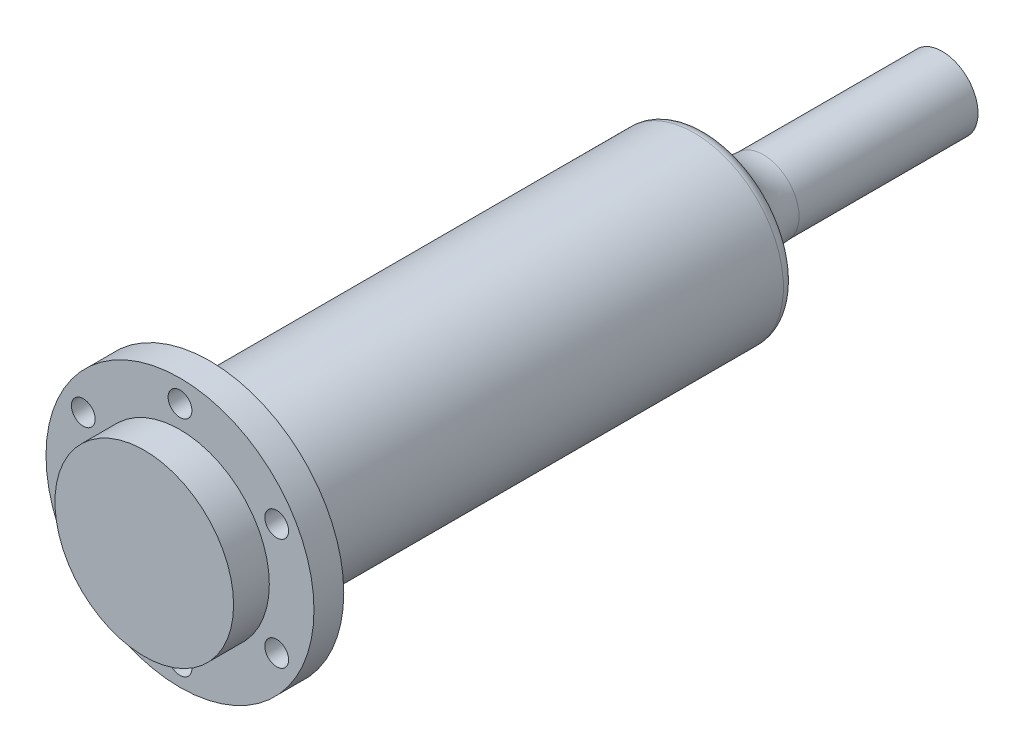
ISO-10303-21;
HEADER;
FILE_DESCRIPTION(('STEP AP214'),'2;1');
FILE_NAME('part.step','',(''),(''),'','','');
FILE_SCHEMA(('AUTOMOTIVE_DESIGN { 1 0 10303 214 1 1 1 1 }'));
ENDSEC;
DATA;
#1=APPLICATION_CONTEXT('core data for automotive mechanical design processes');
#2=APPLICATION_PROTOCOL_DEFINITION('international standard','automotive_design',2000,#1);
#3=PRODUCT_CONTEXT('',#1,'mechanical');
#4=PRODUCT('Part','Part','',(#3));
#5=PRODUCT_RELATED_PRODUCT_CATEGORY('part','',(#4));
#6=PRODUCT_DEFINITION_FORMATION('','',#4);
#7=PRODUCT_DEFINITION_CONTEXT('part definition',#1,'design');
#8=PRODUCT_DEFINITION('design','',#6,#7);
#9=PRODUCT_DEFINITION_SHAPE('','',#8);
#10=(LENGTH_UNIT() NAMED_UNIT(*) SI_UNIT(.MILLI.,.METRE.));
#11=(NAMED_UNIT(*) PLANE_ANGLE_UNIT() SI_UNIT($,.RADIAN.));
#12=(NAMED_UNIT(*) SI_UNIT($,.STERADIAN.) SOLID_ANGLE_UNIT());
#13=UNCERTAINTY_MEASURE_WITH_UNIT(LENGTH_MEASURE(1.E-05),#10,'distance_accuracy_value','');
#14=(GEOMETRIC_REPRESENTATION_CONTEXT(3) GLOBAL_UNCERTAINTY_ASSIGNED_CONTEXT((#13)) GLOBAL_UNIT_ASSIGNED_CONTEXT((#10,
#11,#12)) REPRESENTATION_CONTEXT('',''));
#15=CARTESIAN_POINT('',(0.,0.,0.));
#16=DIRECTION('',(0.,0.,1.));
#17=DIRECTION('',(1.,0.,0.));
#18=AXIS2_PLACEMENT_3D('',#15,#16,#17);
#19=CARTESIAN_POINT('',(0.,0.,77.));
#20=DIRECTION('',(0.,0.,-1.));
#21=DIRECTION('',(-1.,0.,0.));
#22=AXIS2_PLACEMENT_3D('',#19,#20,#21);
#23=CYLINDRICAL_SURFACE('',#22,15.);
#24=CARTESIAN_POINT('',(0.,0.,88.));
#25=DIRECTION('',(0.,0.,1.));
#26=DIRECTION('',(1.,0.,0.));
#27=AXIS2_PLACEMENT_3D('',#24,#25,#26);
#28=CIRCLE('',#27,15.);
#29=CARTESIAN_POINT('',(15.,0.,88.));
#30=VERTEX_POINT('',#29);
#31=EDGE_CURVE('E54',#30,#30,#28,.T.);
#32=ORIENTED_EDGE('',*,*,#31,.T.);
#33=EDGE_LOOP('',(#32));
#34=FACE_BOUND('',#33,.T.);
#35=CARTESIAN_POINT('',(0.,0.,94.));
#36=DIRECTION('',(0.,0.,1.));
#37=DIRECTION('',(1.,0.,0.));
#38=AXIS2_PLACEMENT_3D('',#35,#36,#37);
#39=CIRCLE('',#38,15.);
#40=CARTESIAN_POINT('',(15.,0.,94.));
#41=VERTEX_POINT('',#40);
#42=EDGE_CURVE('E53',#41,#41,#39,.T.);
#43=ORIENTED_EDGE('',*,*,#42,.F.);
#44=EDGE_LOOP('',(#43));
#45=FACE_BOUND('',#44,.T.);
#46=ADVANCED_FACE('F33',(#34,#45),#23,.T.);
#47=CARTESIAN_POINT('',(0.,0.,94.));
#48=DIRECTION('',(0.,0.,1.));
#49=DIRECTION('',(1.,0.,0.));
#50=AXIS2_PLACEMENT_3D('',#47,#48,#49);
#51=PLANE('',#50);
#52=ORIENTED_EDGE('',*,*,#42,.T.);
#53=EDGE_LOOP('',(#52));
#54=FACE_BOUND('',#53,.T.);
#55=ADVANCED_FACE('F120',(#54),#51,.T.);
#56=CARTESIAN_POINT('',(0.,0.,83.));
#57=DIRECTION('',(0.,0.,1.));
#58=DIRECTION('',(1.,0.,0.));
#59=AXIS2_PLACEMENT_3D('',#56,#57,#58);
#60=CYLINDRICAL_SURFACE('',#59,22.5);
#61=CARTESIAN_POINT('',(0.,0.,83.));
#62=DIRECTION('',(0.,0.,1.));
#63=DIRECTION('',(1.,0.,0.));
#64=AXIS2_PLACEMENT_3D('',#61,#62,#63);
#65=CIRCLE('',#64,22.5);
#66=CARTESIAN_POINT('',(22.5,0.,83.));
#67=VERTEX_POINT('',#66);
#68=EDGE_CURVE('E57',#67,#67,#65,.T.);
#69=ORIENTED_EDGE('',*,*,#68,.T.);
#70=EDGE_LOOP('',(#69));
#71=FACE_BOUND('',#70,.T.);
#72=CARTESIAN_POINT('',(0.,0.,88.));
#73=DIRECTION('',(0.,0.,1.));
#74=DIRECTION('',(1.,0.,0.));
#75=AXIS2_PLACEMENT_3D('',#72,#73,#74);
#76=CIRCLE('',#75,22.5);
#77=CARTESIAN_POINT('',(22.5,0.,88.));
#78=VERTEX_POINT('',#77);
#79=EDGE_CURVE('E60',#78,#78,#76,.T.);
#80=ORIENTED_EDGE('',*,*,#79,.F.);
#81=EDGE_LOOP('',(#80));
#82=FACE_BOUND('',#81,.T.);
#83=ADVANCED_FACE('F126',(#71,#82),#60,.T.);
#84=CARTESIAN_POINT('',(0.,0.,83.));
#85=DIRECTION('',(0.,0.,1.));
#86=DIRECTION('',(1.,0.,0.));
#87=AXIS2_PLACEMENT_3D('',#84,#85,#86);
#88=PLANE('',#87);
#89=CARTESIAN_POINT('',(0.,0.,83.));
#90=DIRECTION('',(0.,0.,1.));
#91=DIRECTION('',(1.,0.,0.));
#92=AXIS2_PLACEMENT_3D('',#89,#90,#91);
#93=CIRCLE('',#92,15.);
#94=CARTESIAN_POINT('',(15.,0.,83.));
#95=VERTEX_POINT('',#94);
#96=EDGE_CURVE('E48',#95,#95,#93,.T.);
#97=ORIENTED_EDGE('',*,*,#96,.T.);
#98=EDGE_LOOP('',(#97));
#99=FACE_BOUND('',#98,.T.);
#100=CARTESIAN_POINT('',(-16.2379763209579,9.37499999999936,83.));
#101=DIRECTION('',(0.,0.,1.));
#102=DIRECTION('',(1.,0.,0.));
#103=AXIS2_PLACEMENT_3D('',#100,#101,#102);
#104=CIRCLE('',#103,2.);
#105=CARTESIAN_POINT('',(-14.2379763209579,9.37499999999936,83.));
#106=VERTEX_POINT('',#105);
#107=EDGE_CURVE('E93',#106,#106,#104,.T.);
#108=ORIENTED_EDGE('',*,*,#107,.T.);
#109=EDGE_LOOP('',(#108));
#110=FACE_BOUND('',#109,.T.);
#111=CARTESIAN_POINT('',(-16.2379763209571,-9.37500000000063,83.));
#112=DIRECTION('',(0.,0.,1.));
#113=DIRECTION('',(1.,0.,0.));
#114=AXIS2_PLACEMENT_3D('',#111,#112,#113);
#115=CIRCLE('',#114,2.);
#116=CARTESIAN_POINT('',(-14.2379763209571,-9.37500000000063,83.));
#117=VERTEX_POINT('',#116);
#118=EDGE_CURVE('E87',#117,#117,#115,.T.);
#119=ORIENTED_EDGE('',*,*,#118,.T.);
#120=EDGE_LOOP('',(#119));
#121=FACE_BOUND('',#120,.T.);
#122=CARTESIAN_POINT('',(1.4434757954648E-12,-18.75,83.));
#123=DIRECTION('',(0.,0.,1.));
#124=DIRECTION('',(1.,0.,0.));
#125=AXIS2_PLACEMENT_3D('',#122,#123,#124);
#126=CIRCLE('',#125,2.);
#127=CARTESIAN_POINT('',(2.00000000000144,-18.75,83.));
#128=VERTEX_POINT('',#127);
#129=EDGE_CURVE('E81',#128,#128,#126,.T.);
#130=ORIENTED_EDGE('',*,*,#129,.T.);
#131=EDGE_LOOP('',(#130));
#132=FACE_BOUND('',#131,.T.);
#133=CARTESIAN_POINT('',(16.2379763209593,-9.37499999999937,83.));
#134=DIRECTION('',(0.,0.,1.));
#135=DIRECTION('',(1.,0.,0.));
#136=AXIS2_PLACEMENT_3D('',#133,#134,#135);
#137=CIRCLE('',#136,2.);
#138=CARTESIAN_POINT('',(18.2379763209593,-9.37499999999937,83.));
#139=VERTEX_POINT('',#138);
#140=EDGE_CURVE('E75',#139,#139,#137,.T.);
#141=ORIENTED_EDGE('',*,*,#140,.T.);
#142=EDGE_LOOP('',(#141));
#143=FACE_BOUND('',#142,.T.);
#144=CARTESIAN_POINT('',(16.2379763209586,9.37500000000063,83.));
#145=DIRECTION('',(0.,0.,1.));
#146=DIRECTION('',(1.,0.,0.));
#147=AXIS2_PLACEMENT_3D('',#144,#145,#146);
#148=CIRCLE('',#147,2.);
#149=CARTESIAN_POINT('',(18.2379763209586,9.37500000000063,83.));
#150=VERTEX_POINT('',#149);
#151=EDGE_CURVE('E69',#150,#150,#148,.T.);
#152=ORIENTED_EDGE('',*,*,#151,.T.);
#153=EDGE_LOOP('',(#152));
#154=FACE_BOUND('',#153,.T.);
#155=CARTESIAN_POINT('',(0.,18.75,83.));
#156=DIRECTION('',(0.,0.,1.));
#157=DIRECTION('',(1.,0.,0.));
#158=AXIS2_PLACEMENT_3D('',#155,#156,#157);
#159=CIRCLE('',#158,2.);
#160=CARTESIAN_POINT('',(2.,18.75,83.));
#161=VERTEX_POINT('',#160);
#162=EDGE_CURVE('E63',#161,#161,#159,.T.);
#163=ORIENTED_EDGE('',*,*,#162,.T.);
#164=EDGE_LOOP('',(#163));
#165=FACE_BOUND('',#164,.T.);
#166=ORIENTED_EDGE('',*,*,#68,.F.);
#167=EDGE_LOOP('',(#166));
#168=FACE_BOUND('',#167,.T.);
#169=ADVANCED_FACE('F140',(#99,#110,#121,#132,#143,#154,#165,#168),#88,.F.);
#170=CARTESIAN_POINT('',(0.,0.,88.));
#171=DIRECTION('',(0.,0.,1.));
#172=DIRECTION('',(1.,0.,0.));
#173=AXIS2_PLACEMENT_3D('',#170,#171,#172);
#174=PLANE('',#173);
#175=ORIENTED_EDGE('',*,*,#31,.F.);
#176=EDGE_LOOP('',(#175));
#177=FACE_BOUND('',#176,.T.);
#178=CARTESIAN_POINT('',(-16.2379763209579,9.37499999999936,88.));
#179=DIRECTION('',(0.,0.,1.));
#180=DIRECTION('',(1.,0.,0.));
#181=AXIS2_PLACEMENT_3D('',#178,#179,#180);
#182=CIRCLE('',#181,2.);
#183=CARTESIAN_POINT('',(-14.2379763209579,9.37499999999936,88.));
#184=VERTEX_POINT('',#183);
#185=EDGE_CURVE('E96',#184,#184,#182,.T.);
#186=ORIENTED_EDGE('',*,*,#185,.F.);
#187=EDGE_LOOP('',(#186));
#188=FACE_BOUND('',#187,.T.);
#189=CARTESIAN_POINT('',(-16.2379763209571,-9.37500000000063,88.));
#190=DIRECTION('',(0.,0.,1.));
#191=DIRECTION('',(1.,0.,0.));
#192=AXIS2_PLACEMENT_3D('',#189,#190,#191);
#193=CIRCLE('',#192,2.);
#194=CARTESIAN_POINT('',(-14.2379763209571,-9.37500000000063,88.));
#195=VERTEX_POINT('',#194);
#196=EDGE_CURVE('E90',#195,#195,#193,.T.);
#197=ORIENTED_EDGE('',*,*,#196,.F.);
#198=EDGE_LOOP('',(#197));
#199=FACE_BOUND('',#198,.T.);
#200=CARTESIAN_POINT('',(1.4434757954648E-12,-18.75,88.));
#201=DIRECTION('',(0.,0.,1.));
#202=DIRECTION('',(1.,0.,0.));
#203=AXIS2_PLACEMENT_3D('',#200,#201,#202);
#204=CIRCLE('',#203,2.);
#205=CARTESIAN_POINT('',(2.00000000000144,-18.75,88.));
#206=VERTEX_POINT('',#205);
#207=EDGE_CURVE('E84',#206,#206,#204,.T.);
#208=ORIENTED_EDGE('',*,*,#207,.F.);
#209=EDGE_LOOP('',(#208));
#210=FACE_BOUND('',#209,.T.);
#211=CARTESIAN_POINT('',(16.2379763209593,-9.37499999999937,88.));
#212=DIRECTION('',(0.,0.,1.));
#213=DIRECTION('',(1.,0.,0.));
#214=AXIS2_PLACEMENT_3D('',#211,#212,#213);
#215=CIRCLE('',#214,2.);
#216=CARTESIAN_POINT('',(18.2379763209593,-9.37499999999937,88.));
#217=VERTEX_POINT('',#216);
#218=EDGE_CURVE('E78',#217,#217,#215,.T.);
#219=ORIENTED_EDGE('',*,*,#218,.F.);
#220=EDGE_LOOP('',(#219));
#221=FACE_BOUND('',#220,.T.);
#222=CARTESIAN_POINT('',(16.2379763209586,9.37500000000063,88.));
#223=DIRECTION('',(0.,0.,1.));
#224=DIRECTION('',(1.,0.,0.));
#225=AXIS2_PLACEMENT_3D('',#222,#223,#224);
#226=CIRCLE('',#225,2.);
#227=CARTESIAN_POINT('',(18.2379763209586,9.37500000000063,88.));
#228=VERTEX_POINT('',#227);
#229=EDGE_CURVE('E72',#228,#228,#226,.T.);
#230=ORIENTED_EDGE('',*,*,#229,.F.);
#231=EDGE_LOOP('',(#230));
#232=FACE_BOUND('',#231,.T.);
#233=CARTESIAN_POINT('',(0.,18.75,88.));
#234=DIRECTION('',(0.,0.,1.));
#235=DIRECTION('',(1.,0.,0.));
#236=AXIS2_PLACEMENT_3D('',#233,#234,#235);
#237=CIRCLE('',#236,2.);
#238=CARTESIAN_POINT('',(2.,18.75,88.));
#239=VERTEX_POINT('',#238);
#240=EDGE_CURVE('E66',#239,#239,#237,.T.);
#241=ORIENTED_EDGE('',*,*,#240,.F.);
#242=EDGE_LOOP('',(#241));
#243=FACE_BOUND('',#242,.T.);
#244=ORIENTED_EDGE('',*,*,#79,.T.);
#245=EDGE_LOOP('',(#244));
#246=FACE_BOUND('',#245,.T.);
#247=ADVANCED_FACE('F143',(#177,#188,#199,#210,#221,#232,#243,#246),#174,.T.);
#248=CARTESIAN_POINT('',(0.,18.75,83.));
#249=DIRECTION('',(0.,0.,1.));
#250=DIRECTION('',(1.,0.,0.));
#251=AXIS2_PLACEMENT_3D('',#248,#249,#250);
#252=CYLINDRICAL_SURFACE('',#251,2.);
#253=ORIENTED_EDGE('',*,*,#162,.F.);
#254=EDGE_LOOP('',(#253));
#255=FACE_BOUND('',#254,.T.);
#256=ORIENTED_EDGE('',*,*,#240,.T.);
#257=EDGE_LOOP('',(#256));
#258=FACE_BOUND('',#257,.T.);
#259=ADVANCED_FACE('F165',(#255,#258),#252,.F.);
#260=CARTESIAN_POINT('',(16.2379763209586,9.37500000000063,83.));
#261=DIRECTION('',(0.,0.,1.));
#262=DIRECTION('',(1.,0.,0.));
#263=AXIS2_PLACEMENT_3D('',#260,#261,#262);
#264=CYLINDRICAL_SURFACE('',#263,2.);
#265=ORIENTED_EDGE('',*,*,#151,.F.);
#266=EDGE_LOOP('',(#265));
#267=FACE_BOUND('',#266,.T.);
#268=ORIENTED_EDGE('',*,*,#229,.T.);
#269=EDGE_LOOP('',(#268));
#270=FACE_BOUND('',#269,.T.);
#271=ADVANCED_FACE('F171',(#267,#270),#264,.F.);
#272=CARTESIAN_POINT('',(16.2379763209593,-9.37499999999937,83.));
#273=DIRECTION('',(0.,0.,1.));
#274=DIRECTION('',(1.,0.,0.));
#275=AXIS2_PLACEMENT_3D('',#272,#273,#274);
#276=CYLINDRICAL_SURFACE('',#275,2.);
#277=ORIENTED_EDGE('',*,*,#140,.F.);
#278=EDGE_LOOP('',(#277));
#279=FACE_BOUND('',#278,.T.);
#280=ORIENTED_EDGE('',*,*,#218,.T.);
#281=EDGE_LOOP('',(#280));
#282=FACE_BOUND('',#281,.T.);
#283=ADVANCED_FACE('F179',(#279,#282),#276,.F.);
#284=CARTESIAN_POINT('',(1.4434757954648E-12,-18.75,83.));
#285=DIRECTION('',(0.,0.,1.));
#286=DIRECTION('',(1.,0.,0.));
#287=AXIS2_PLACEMENT_3D('',#284,#285,#286);
#288=CYLINDRICAL_SURFACE('',#287,2.);
#289=ORIENTED_EDGE('',*,*,#129,.F.);
#290=EDGE_LOOP('',(#289));
#291=FACE_BOUND('',#290,.T.);
#292=ORIENTED_EDGE('',*,*,#207,.T.);
#293=EDGE_LOOP('',(#292));
#294=FACE_BOUND('',#293,.T.);
#295=ADVANCED_FACE('F183',(#291,#294),#288,.F.);
#296=CARTESIAN_POINT('',(-16.2379763209571,-9.37500000000063,83.));
#297=DIRECTION('',(0.,0.,1.));
#298=DIRECTION('',(1.,0.,0.));
#299=AXIS2_PLACEMENT_3D('',#296,#297,#298);
#300=CYLINDRICAL_SURFACE('',#299,2.);
#301=ORIENTED_EDGE('',*,*,#118,.F.);
#302=EDGE_LOOP('',(#301));
#303=FACE_BOUND('',#302,.T.);
#304=ORIENTED_EDGE('',*,*,#196,.T.);
#305=EDGE_LOOP('',(#304));
#306=FACE_BOUND('',#305,.T.);
#307=ADVANCED_FACE('F135',(#303,#306),#300,.F.);
#308=CARTESIAN_POINT('',(-16.2379763209579,9.37499999999936,83.));
#309=DIRECTION('',(0.,0.,1.));
#310=DIRECTION('',(1.,0.,0.));
#311=AXIS2_PLACEMENT_3D('',#308,#309,#310);
#312=CYLINDRICAL_SURFACE('',#311,2.);
#313=ORIENTED_EDGE('',*,*,#107,.F.);
#314=EDGE_LOOP('',(#313));
#315=FACE_BOUND('',#314,.T.);
#316=ORIENTED_EDGE('',*,*,#185,.T.);
#317=EDGE_LOOP('',(#316));
#318=FACE_BOUND('',#317,.T.);
#319=ADVANCED_FACE('F131',(#315,#318),#312,.F.);
#320=CARTESIAN_POINT('',(0.,0.,1.66907566755606));
#321=DIRECTION('',(0.,0.,-1.));
#322=DIRECTION('',(-1.,0.,0.));
#323=AXIS2_PLACEMENT_3D('',#320,#321,#322);
#324=CIRCLE('',#323,15.);
#325=CARTESIAN_POINT('',(-15.,0.,1.66907566755606));
#326=VERTEX_POINT('',#325);
#327=EDGE_CURVE('E40',#326,#326,#324,.F.);
#328=ORIENTED_EDGE('',*,*,#327,.T.);
#329=EDGE_LOOP('',(#328));
#330=FACE_BOUND('',#329,.T.);
#331=ORIENTED_EDGE('',*,*,#96,.F.);
#332=EDGE_LOOP('',(#331));
#333=FACE_BOUND('',#332,.T.);
#334=ADVANCED_FACE('F116',(#330,#333),#23,.T.);
#335=CARTESIAN_POINT('',(0.,0.,-40.));
#336=DIRECTION('',(0.,0.,-1.));
#337=DIRECTION('',(-1.,0.,0.));
#338=AXIS2_PLACEMENT_3D('',#335,#336,#337);
#339=PLANE('',#338);
#340=CARTESIAN_POINT('',(0.,0.,-40.));
#341=DIRECTION('',(0.,0.,-1.));
#342=DIRECTION('',(-1.,0.,0.));
#343=AXIS2_PLACEMENT_3D('',#340,#341,#342);
#344=CIRCLE('',#343,6.);
#345=CARTESIAN_POINT('',(-6.,0.,-40.));
#346=VERTEX_POINT('',#345);
#347=EDGE_CURVE('E99',#346,#346,#344,.T.);
#348=ORIENTED_EDGE('',*,*,#347,.T.);
#349=EDGE_LOOP('',(#348));
#350=FACE_BOUND('',#349,.T.);
#351=ADVANCED_FACE('F105',(#350),#339,.T.);
#352=CARTESIAN_POINT('',(0.,0.,-40.));
#353=DIRECTION('',(0.,0.,1.));
#354=DIRECTION('',(1.,0.,0.));
#355=AXIS2_PLACEMENT_3D('',#352,#353,#354);
#356=CYLINDRICAL_SURFACE('',#355,6.);
#357=CARTESIAN_POINT('',(0.,0.,-9.9498743710662));
#358=DIRECTION('',(0.,0.,1.));
#359=DIRECTION('',(1.,0.,0.));
#360=AXIS2_PLACEMENT_3D('',#357,#358,#359);
#361=CIRCLE('',#360,6.);
#362=CARTESIAN_POINT('',(6.,0.,-9.9498743710662));
#363=VERTEX_POINT('',#362);
#364=EDGE_CURVE('E44',#363,#363,#361,.F.);
#365=ORIENTED_EDGE('',*,*,#364,.T.);
#366=EDGE_LOOP('',(#365));
#367=FACE_BOUND('',#366,.T.);
#368=ORIENTED_EDGE('',*,*,#347,.F.);
#369=EDGE_LOOP('',(#368));
#370=FACE_BOUND('',#369,.T.);
#371=ADVANCED_FACE('F107',(#367,#370),#356,.T.);
#372=CARTESIAN_POINT('',(0.,0.,-9.9498743710662));
#373=DIRECTION('',(0.,0.,1.));
#374=DIRECTION('',(1.,0.,0.));
#375=AXIS2_PLACEMENT_3D('',#372,#373,#374);
#376=TOROIDAL_SURFACE('',#375,16.,10.);
#377=CARTESIAN_POINT('',(0.,0.,-0.26741600554769));
#378=DIRECTION('',(0.,0.,-1.));
#379=DIRECTION('',(-1.,0.,0.));
#380=AXIS2_PLACEMENT_3D('',#377,#378,#379);
#381=CIRCLE('',#380,13.5);
#382=CARTESIAN_POINT('',(-13.5,0.,-0.26741600554769));
#383=VERTEX_POINT('',#382);
#384=EDGE_CURVE('E11',#383,#383,#381,.T.);
#385=ORIENTED_EDGE('',*,*,#384,.T.);
#386=EDGE_LOOP('',(#385));
#387=FACE_BOUND('',#386,.T.);
#388=ORIENTED_EDGE('',*,*,#364,.F.);
#389=EDGE_LOOP('',(#388));
#390=FACE_BOUND('',#389,.T.);
#391=ADVANCED_FACE('F109',(#387,#390),#376,.F.);
#392=CARTESIAN_POINT('',(0.,0.,1.66907566755605));
#393=DIRECTION('',(0.,0.,-1.));
#394=DIRECTION('',(-1.,0.,0.));
#395=AXIS2_PLACEMENT_3D('',#392,#393,#394);
#396=TOROIDAL_SURFACE('',#395,13.,2.);
#397=ORIENTED_EDGE('',*,*,#384,.F.);
#398=EDGE_LOOP('',(#397));
#399=FACE_BOUND('',#398,.T.);
#400=ORIENTED_EDGE('',*,*,#327,.F.);
#401=EDGE_LOOP('',(#400));
#402=FACE_BOUND('',#401,.T.);
#403=ADVANCED_FACE('F35',(#399,#402),#396,.T.);
#404=CLOSED_SHELL('',(#46,#55,#83,#169,#247,#259,#271,#283,#295,#307,#319,#334,#351,#371,#391,#403));
#405=MANIFOLD_SOLID_BREP('B2',#404);
#406=ADVANCED_BREP_SHAPE_REPRESENTATION('',(#18,#405),#14);
#407=SHAPE_DEFINITION_REPRESENTATION(#9,#406);
ENDSEC;
END-ISO-10303-21;
